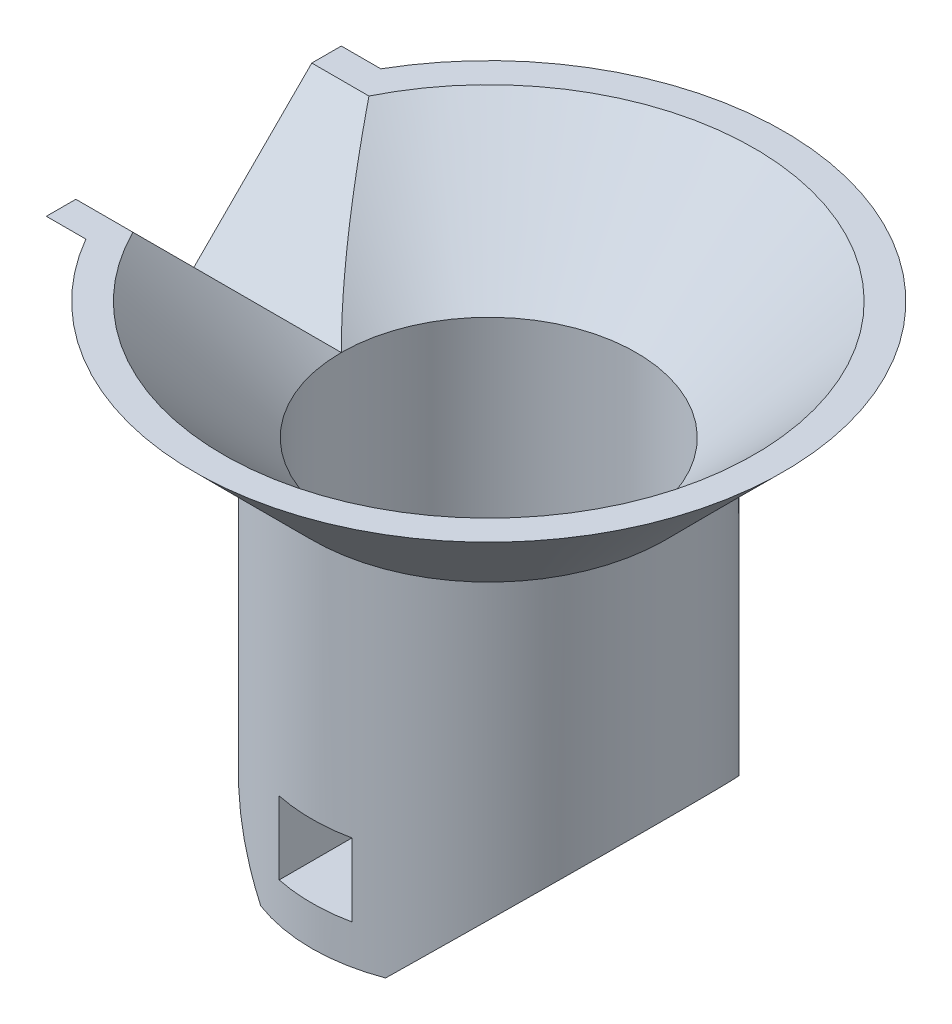
ISO-10303-21;
HEADER;
FILE_DESCRIPTION(('STEP AP214'),'2;1');
FILE_NAME('part.step','',(''),(''),'','','');
FILE_SCHEMA(('AUTOMOTIVE_DESIGN { 1 0 10303 214 1 1 1 1 }'));
ENDSEC;
DATA;
#1=APPLICATION_CONTEXT('core data for automotive mechanical design processes');
#2=APPLICATION_PROTOCOL_DEFINITION('international standard','automotive_design',2000,#1);
#3=PRODUCT_CONTEXT('',#1,'mechanical');
#4=PRODUCT('Part','Part','',(#3));
#5=PRODUCT_RELATED_PRODUCT_CATEGORY('part','',(#4));
#6=PRODUCT_DEFINITION_FORMATION('','',#4);
#7=PRODUCT_DEFINITION_CONTEXT('part definition',#1,'design');
#8=PRODUCT_DEFINITION('design','',#6,#7);
#9=PRODUCT_DEFINITION_SHAPE('','',#8);
#10=(LENGTH_UNIT() NAMED_UNIT(*) SI_UNIT(.MILLI.,.METRE.));
#11=(NAMED_UNIT(*) PLANE_ANGLE_UNIT() SI_UNIT($,.RADIAN.));
#12=(NAMED_UNIT(*) SI_UNIT($,.STERADIAN.) SOLID_ANGLE_UNIT());
#13=UNCERTAINTY_MEASURE_WITH_UNIT(LENGTH_MEASURE(1.E-05),#10,'distance_accuracy_value','');
#14=(GEOMETRIC_REPRESENTATION_CONTEXT(3) GLOBAL_UNCERTAINTY_ASSIGNED_CONTEXT((#13)) GLOBAL_UNIT_ASSIGNED_CONTEXT((#10,
#11,#12)) REPRESENTATION_CONTEXT('',''));
#15=CARTESIAN_POINT('',(0.,0.,0.));
#16=DIRECTION('',(0.,0.,1.));
#17=DIRECTION('',(1.,0.,0.));
#18=AXIS2_PLACEMENT_3D('',#15,#16,#17);
#19=CARTESIAN_POINT('',(500000.,16.5,0.));
#20=DIRECTION('',(0.,0.707106781186547,0.707106781186548));
#21=DIRECTION('',(0.,-0.707106781186548,0.707106781186547));
#22=AXIS2_PLACEMENT_3D('',#19,#20,#21);
#23=PLANE('',#22);
#24=DIRECTION('',(1.,0.,0.));
#25=VECTOR('',#24,1.);
#26=CARTESIAN_POINT('',(500000.,17.25,-0.75));
#27=LINE('',#26,#25);
#28=CARTESIAN_POINT('',(-15.,17.25,-0.75));
#29=VERTEX_POINT('',#28);
#30=CARTESIAN_POINT('',(-8.96869555731428,17.25,-0.75));
#31=VERTEX_POINT('',#30);
#32=EDGE_CURVE('E42',#29,#31,#27,.T.);
#33=ORIENTED_EDGE('',*,*,#32,.F.);
#34=DIRECTION('',(0.,0.707106781186548,-0.707106781186547));
#35=VECTOR('',#34,1.);
#36=CARTESIAN_POINT('',(-15.,16.5,0.));
#37=LINE('',#36,#35);
#38=CARTESIAN_POINT('',(-15.,24.,-7.5));
#39=VERTEX_POINT('',#38);
#40=EDGE_CURVE('E328',#29,#39,#37,.T.);
#41=ORIENTED_EDGE('',*,*,#40,.T.);
#42=DIRECTION('',(-1.,0.,0.));
#43=VECTOR('',#42,1.);
#44=CARTESIAN_POINT('',(500000.,24.,-7.5));
#45=LINE('',#44,#43);
#46=CARTESIAN_POINT('',(-12.9903810567384,24.,-7.5));
#47=VERTEX_POINT('',#46);
#48=EDGE_CURVE('E336',#47,#39,#45,.T.);
#49=ORIENTED_EDGE('',*,*,#48,.F.);
#50=CARTESIAN_POINT('',(-12.9904965263072,24.0002,-7.5002));
#51=CARTESIAN_POINT('',(-12.8417885807923,23.7426407491489,-7.24264074914892));
#52=CARTESIAN_POINT('',(-12.6909089126215,23.4857128176287,-6.98571281762869));
#53=CARTESIAN_POINT('',(-12.384370655667,22.9732753628268,-6.4732753628268));
#54=CARTESIAN_POINT('',(-12.2287118807498,22.7177658952494,-6.21776589524938));
#55=CARTESIAN_POINT('',(-11.7543725596912,21.95433918256,-5.45433918256002));
#56=CARTESIAN_POINT('',(-11.4279167122423,21.44880448999,-4.94880448999005));
#57=CARTESIAN_POINT('',(-10.9191975176582,20.6966810650989,-4.19668106509887));
#58=CARTESIAN_POINT('',(-10.7463689324467,20.4468908141695,-3.94689081416945));
#59=CARTESIAN_POINT('',(-10.3936692515622,19.949816332837,-3.44981633283699));
#60=CARTESIAN_POINT('',(-10.2137984821008,19.7025319870206,-3.20253198702059));
#61=CARTESIAN_POINT('',(-9.84593619543638,19.2105665143829,-2.71056651438294));
#62=CARTESIAN_POINT('',(-9.65793409250952,18.9658893314032,-2.46588933140316));
#63=CARTESIAN_POINT('',(-9.27294232527565,18.480046733962,-1.98004673396203));
#64=CARTESIAN_POINT('',(-9.07595114731007,18.2388819200302,-1.73888192003024));
#65=CARTESIAN_POINT('',(-8.87395064218863,17.9998,-1.4998));
#66=B_SPLINE_CURVE_WITH_KNOTS('',3,(#50,#51,#52,#53,#54,#55,#56,#57,#58,#59,#60,#61,#62,#63,#64,
#65),.UNSPECIFIED.,.F.,.F.,(4,2,2,2,2,2,2,4),(0.,1.18026959629429,2.36058521944181,
4.71792521500284,5.89766893658841,7.07735807401865,8.2586321492312,9.44010587700062),.UNSPECIFIED.);
#67=CARTESIAN_POINT('',(-8.87411967464942,18.,-1.5));
#68=VERTEX_POINT('',#67);
#69=EDGE_CURVE('E184',#47,#68,#66,.T.);
#70=ORIENTED_EDGE('',*,*,#69,.T.);
#71=CARTESIAN_POINT('',(0.,16.5,0.));
#72=DIRECTION('',(0.,0.707106781186547,0.707106781186548));
#73=DIRECTION('',(0.,-0.707106781186548,0.707106781186547));
#74=AXIS2_PLACEMENT_3D('',#71,#72,#73);
#75=ELLIPSE('',#74,12.7279220613579,9.);
#76=EDGE_CURVE('E176',#31,#68,#75,.F.);
#77=ORIENTED_EDGE('',*,*,#76,.F.);
#78=EDGE_LOOP('',(#33,#41,#49,#70,#77));
#79=FACE_BOUND('',#78,.T.);
#80=ADVANCED_FACE('F34',(#79),#23,.F.);
#81=CARTESIAN_POINT('',(0.,18.,0.));
#82=DIRECTION('',(0.,1.,0.));
#83=DIRECTION('',(0.,0.,1.));
#84=AXIS2_PLACEMENT_3D('',#81,#82,#83);
#85=CONICAL_SURFACE('',#84,9.,0.785398163397446);
#86=CARTESIAN_POINT('',(0.,24.,0.));
#87=DIRECTION('',(0.,-1.,0.));
#88=DIRECTION('',(0.,0.,-1.));
#89=AXIS2_PLACEMENT_3D('',#86,#87,#88);
#90=CIRCLE('',#89,15.);
#91=CARTESIAN_POINT('',(-12.9903810567384,24.,7.50000000000001));
#92=VERTEX_POINT('',#91);
#93=EDGE_CURVE('E363',#47,#92,#90,.T.);
#94=ORIENTED_EDGE('',*,*,#93,.T.);
#95=CARTESIAN_POINT('',(-8.87395064218863,17.9998,1.4998));
#96=CARTESIAN_POINT('',(-9.07595114731007,18.2388819200302,1.73888192003024));
#97=CARTESIAN_POINT('',(-9.27294232527565,18.480046733962,1.98004673396203));
#98=CARTESIAN_POINT('',(-9.65793409250952,18.9658893314032,2.46588933140316));
#99=CARTESIAN_POINT('',(-9.84593619543638,19.2105665143829,2.71056651438294));
#100=CARTESIAN_POINT('',(-10.2137984821008,19.7025319870206,3.20253198702059));
#101=CARTESIAN_POINT('',(-10.3936692515622,19.949816332837,3.44981633283699));
#102=CARTESIAN_POINT('',(-10.7463689324467,20.4468908141694,3.94689081416945));
#103=CARTESIAN_POINT('',(-10.9191975176581,20.6966810650989,4.19668106509887));
#104=CARTESIAN_POINT('',(-11.4279167122423,21.44880448999,4.94880448999005));
#105=CARTESIAN_POINT('',(-11.7543725596912,21.95433918256,5.45433918256002));
#106=CARTESIAN_POINT('',(-12.2287118807497,22.7177658952494,6.21776589524938));
#107=CARTESIAN_POINT('',(-12.384370655667,22.9732753628268,6.4732753628268));
#108=CARTESIAN_POINT('',(-12.6909089126215,23.4857128176287,6.98571281762868));
#109=CARTESIAN_POINT('',(-12.8417885807924,23.7426407491489,7.2426407491489));
#110=CARTESIAN_POINT('',(-12.9904965263073,24.0001999999999,7.50019999999994));
#111=B_SPLINE_CURVE_WITH_KNOTS('',3,(#95,#96,#97,#98,#99,#100,#101,#102,#103,#104,#105,#106,
#107,#108,#109,#110),.UNSPECIFIED.,.F.,.F.,(4,2,2,2,2,2,2,4),(0.,1.18147372776941,
2.36274780298197,3.5424369404122,4.72218066199777,7.07952065755879,8.25983628070631,
9.44010587700059),.UNSPECIFIED.);
#112=CARTESIAN_POINT('',(-8.87411967464942,18.,1.5));
#113=VERTEX_POINT('',#112);
#114=EDGE_CURVE('E177',#113,#92,#111,.T.);
#115=ORIENTED_EDGE('',*,*,#114,.F.);
#116=CARTESIAN_POINT('',(0.,18.,0.));
#117=DIRECTION('',(0.,1.,0.));
#118=DIRECTION('',(0.,0.,1.));
#119=AXIS2_PLACEMENT_3D('',#116,#117,#118);
#120=CIRCLE('',#119,9.);
#121=EDGE_CURVE('E301',#113,#68,#120,.T.);
#122=ORIENTED_EDGE('',*,*,#121,.T.);
#123=ORIENTED_EDGE('',*,*,#69,.F.);
#124=EDGE_LOOP('',(#94,#115,#122,#123));
#125=FACE_BOUND('',#124,.T.);
#126=ADVANCED_FACE('F209',(#125),#85,.T.);
#127=CARTESIAN_POINT('',(0.,18.,0.));
#128=DIRECTION('',(0.,-1.,0.));
#129=DIRECTION('',(0.,0.,-1.));
#130=AXIS2_PLACEMENT_3D('',#127,#128,#129);
#131=CYLINDRICAL_SURFACE('',#130,9.);
#132=CARTESIAN_POINT('',(0.,0.,0.));
#133=DIRECTION('',(0.,1.,0.));
#134=DIRECTION('',(0.,0.,1.));
#135=AXIS2_PLACEMENT_3D('',#132,#133,#134);
#136=CIRCLE('',#135,9.);
#137=CARTESIAN_POINT('',(-3.175,0.,8.42136420065063));
#138=VERTEX_POINT('',#137);
#139=CARTESIAN_POINT('',(3.175,0.,8.42136420065063));
#140=VERTEX_POINT('',#139);
#141=EDGE_CURVE('E298',#138,#140,#136,.T.);
#142=ORIENTED_EDGE('',*,*,#141,.T.);
#143=CARTESIAN_POINT('',(0.,-3.1068669527897,0.));
#144=DIRECTION('',(-0.699396374552726,0.714734014345549,0.));
#145=DIRECTION('',(-0.714734014345549,-0.699396374552726,0.));
#146=AXIS2_PLACEMENT_3D('',#143,#144,#145);
#147=ELLIPSE('',#146,12.5920969470593,9.);
#148=CARTESIAN_POINT('',(3.175,0.,-8.42136420065063));
#149=VERTEX_POINT('',#148);
#150=EDGE_CURVE('E302',#140,#149,#147,.T.);
#151=ORIENTED_EDGE('',*,*,#150,.T.);
#152=CARTESIAN_POINT('',(-3.175,0.,-8.42136420065063));
#153=VERTEX_POINT('',#152);
#154=EDGE_CURVE('E289',#149,#153,#136,.T.);
#155=ORIENTED_EDGE('',*,*,#154,.T.);
#156=CARTESIAN_POINT('',(0.,-3.1068669527897,0.));
#157=DIRECTION('',(0.699396374552726,0.714734014345549,0.));
#158=DIRECTION('',(0.714734014345549,-0.699396374552726,0.));
#159=AXIS2_PLACEMENT_3D('',#156,#157,#158);
#160=ELLIPSE('',#159,12.5920969470593,9.);
#161=EDGE_CURVE('E299',#153,#138,#160,.T.);
#162=ORIENTED_EDGE('',*,*,#161,.T.);
#163=EDGE_LOOP('',(#142,#151,#155,#162));
#164=FACE_BOUND('',#163,.T.);
#165=DIRECTION('',(0.,-1.,0.));
#166=VECTOR('',#165,1.);
#167=CARTESIAN_POINT('',(1.85,18.,8.80780903516874));
#168=LINE('',#167,#166);
#169=CARTESIAN_POINT('',(1.85,5.7,8.80780903516874));
#170=VERTEX_POINT('',#169);
#171=CARTESIAN_POINT('',(1.85,2.,8.80780903516873));
#172=VERTEX_POINT('',#171);
#173=EDGE_CURVE('E319',#170,#172,#168,.T.);
#174=ORIENTED_EDGE('',*,*,#173,.T.);
#175=CARTESIAN_POINT('',(0.,2.,0.));
#176=DIRECTION('',(0.,-1.,0.));
#177=DIRECTION('',(1.,0.,0.));
#178=AXIS2_PLACEMENT_3D('',#175,#176,#177);
#179=CIRCLE('',#178,9.);
#180=CARTESIAN_POINT('',(-1.85,2.,8.80780903516873));
#181=VERTEX_POINT('',#180);
#182=EDGE_CURVE('E308',#172,#181,#179,.T.);
#183=ORIENTED_EDGE('',*,*,#182,.T.);
#184=DIRECTION('',(0.,-1.,0.));
#185=VECTOR('',#184,1.);
#186=CARTESIAN_POINT('',(-1.85,18.,8.80780903516873));
#187=LINE('',#186,#185);
#188=CARTESIAN_POINT('',(-1.85,5.7,8.80780903516873));
#189=VERTEX_POINT('',#188);
#190=EDGE_CURVE('E315',#181,#189,#187,.F.);
#191=ORIENTED_EDGE('',*,*,#190,.T.);
#192=CARTESIAN_POINT('',(0.,5.7,0.));
#193=DIRECTION('',(0.,1.,0.));
#194=DIRECTION('',(-1.,0.,0.));
#195=AXIS2_PLACEMENT_3D('',#192,#193,#194);
#196=CIRCLE('',#195,9.);
#197=EDGE_CURVE('E311',#189,#170,#196,.T.);
#198=ORIENTED_EDGE('',*,*,#197,.T.);
#199=EDGE_LOOP('',(#174,#183,#191,#198));
#200=FACE_BOUND('',#199,.T.);
#201=DIRECTION('',(0.,-1.,0.));
#202=VECTOR('',#201,1.);
#203=CARTESIAN_POINT('',(-1.85,18.,-8.80780903516873));
#204=LINE('',#203,#202);
#205=CARTESIAN_POINT('',(-1.85,5.7,-8.80780903516873));
#206=VERTEX_POINT('',#205);
#207=CARTESIAN_POINT('',(-1.85,2.,-8.80780903516873));
#208=VERTEX_POINT('',#207);
#209=EDGE_CURVE('E325',#206,#208,#204,.T.);
#210=ORIENTED_EDGE('',*,*,#209,.T.);
#211=CARTESIAN_POINT('',(1.85,2.,-8.80780903516873));
#212=VERTEX_POINT('',#211);
#213=EDGE_CURVE('E312',#208,#212,#179,.T.);
#214=ORIENTED_EDGE('',*,*,#213,.T.);
#215=DIRECTION('',(0.,-1.,0.));
#216=VECTOR('',#215,1.);
#217=CARTESIAN_POINT('',(1.85,18.,-8.80780903516874));
#218=LINE('',#217,#216);
#219=CARTESIAN_POINT('',(1.85,5.7,-8.80780903516874));
#220=VERTEX_POINT('',#219);
#221=EDGE_CURVE('E322',#212,#220,#218,.F.);
#222=ORIENTED_EDGE('',*,*,#221,.T.);
#223=EDGE_CURVE('E316',#220,#206,#196,.T.);
#224=ORIENTED_EDGE('',*,*,#223,.T.);
#225=EDGE_LOOP('',(#210,#214,#222,#224));
#226=FACE_BOUND('',#225,.T.);
#227=CARTESIAN_POINT('',(0.,16.5,0.));
#228=DIRECTION('',(0.,0.707106781186548,-0.707106781186547));
#229=DIRECTION('',(0.,-0.707106781186547,-0.707106781186548));
#230=AXIS2_PLACEMENT_3D('',#227,#228,#229);
#231=ELLIPSE('',#230,12.7279220613578,9.);
#232=CARTESIAN_POINT('',(-8.96869555720059,17.25,0.75));
#233=VERTEX_POINT('',#232);
#234=EDGE_CURVE('E185',#113,#233,#231,.F.);
#235=ORIENTED_EDGE('',*,*,#234,.T.);
#236=DIRECTION('',(0.,-1.,0.));
#237=VECTOR('',#236,1.);
#238=CARTESIAN_POINT('',(-8.96869555732605,18.,0.75));
#239=LINE('',#238,#237);
#240=CARTESIAN_POINT('',(-8.96869555732605,10.4686955573261,0.75));
#241=VERTEX_POINT('',#240);
#242=EDGE_CURVE('E49',#233,#241,#239,.T.);
#243=ORIENTED_EDGE('',*,*,#242,.T.);
#244=CARTESIAN_POINT('',(0.,1.50000000000007,0.));
#245=DIRECTION('',(0.707106781186546,0.707106781186549,0.));
#246=DIRECTION('',(0.707106781186549,-0.707106781186546,0.));
#247=AXIS2_PLACEMENT_3D('',#244,#245,#246);
#248=ELLIPSE('',#247,12.7279220613578,9.);
#249=CARTESIAN_POINT('',(-8.96869555732605,10.4686955573261,-0.75));
#250=VERTEX_POINT('',#249);
#251=EDGE_CURVE('E53',#250,#241,#248,.T.);
#252=ORIENTED_EDGE('',*,*,#251,.F.);
#253=DIRECTION('',(0.,-1.,0.));
#254=VECTOR('',#253,1.);
#255=CARTESIAN_POINT('',(-8.96869555732605,18.,-0.75));
#256=LINE('',#255,#254);
#257=EDGE_CURVE('E166',#31,#250,#256,.T.);
#258=ORIENTED_EDGE('',*,*,#257,.F.);
#259=ORIENTED_EDGE('',*,*,#76,.T.);
#260=ORIENTED_EDGE('',*,*,#121,.F.);
#261=EDGE_LOOP('',(#235,#243,#252,#258,#259,#260));
#262=FACE_BOUND('',#261,.T.);
#263=ADVANCED_FACE('F36',(#164,#200,#226,#262),#131,.T.);
#264=CARTESIAN_POINT('',(0.,6.7,0.));
#265=DIRECTION('',(0.,-1.,0.));
#266=DIRECTION('',(1.,0.,0.));
#267=AXIS2_PLACEMENT_3D('',#264,#265,#266);
#268=PLANE('',#267);
#269=CARTESIAN_POINT('',(0.,6.7,0.));
#270=DIRECTION('',(0.,-1.,0.));
#271=DIRECTION('',(1.,0.,0.));
#272=AXIS2_PLACEMENT_3D('',#269,#270,#271);
#273=CIRCLE('',#272,7.5);
#274=CARTESIAN_POINT('',(7.5,6.70000000000001,0.));
#275=VERTEX_POINT('',#274);
#276=EDGE_CURVE('E379',#275,#275,#273,.F.);
#277=ORIENTED_EDGE('',*,*,#276,.T.);
#278=EDGE_LOOP('',(#277));
#279=FACE_BOUND('',#278,.T.);
#280=ADVANCED_FACE('F254',(#279),#268,.F.);
#281=CARTESIAN_POINT('',(0.,-14.5132034355964,0.));
#282=DIRECTION('',(0.,1.,0.));
#283=DIRECTION('',(0.,0.,1.));
#284=AXIS2_PLACEMENT_3D('',#281,#282,#283);
#285=CYLINDRICAL_SURFACE('',#284,7.5);
#286=CARTESIAN_POINT('',(0.,18.,0.));
#287=DIRECTION('',(0.,-1.,0.));
#288=DIRECTION('',(0.,0.,-1.));
#289=AXIS2_PLACEMENT_3D('',#286,#287,#288);
#290=CIRCLE('',#289,7.5);
#291=CARTESIAN_POINT('',(-7.5,18.,0.));
#292=VERTEX_POINT('',#291);
#293=EDGE_CURVE('E374',#292,#292,#290,.T.);
#294=ORIENTED_EDGE('',*,*,#293,.F.);
#295=EDGE_LOOP('',(#294));
#296=FACE_BOUND('',#295,.T.);
#297=ORIENTED_EDGE('',*,*,#276,.F.);
#298=EDGE_LOOP('',(#297));
#299=FACE_BOUND('',#298,.T.);
#300=ADVANCED_FACE('F249',(#296,#299),#285,.F.);
#301=CARTESIAN_POINT('',(15.,24.,0.));
#302=DIRECTION('',(0.,1.,0.));
#303=DIRECTION('',(0.,0.,1.));
#304=AXIS2_PLACEMENT_3D('',#301,#302,#303);
#305=PLANE('',#304);
#306=DIRECTION('',(1.,0.,0.));
#307=VECTOR('',#306,1.);
#308=CARTESIAN_POINT('',(-15.,24.,-6.));
#309=LINE('',#308,#307);
#310=CARTESIAN_POINT('',(-15.,24.,-6.));
#311=VERTEX_POINT('',#310);
#312=CARTESIAN_POINT('',(-12.0933866224478,24.,-6.));
#313=VERTEX_POINT('',#312);
#314=EDGE_CURVE('E234',#311,#313,#309,.T.);
#315=ORIENTED_EDGE('',*,*,#314,.T.);
#316=CARTESIAN_POINT('',(0.,24.,0.));
#317=DIRECTION('',(0.,-1.,0.));
#318=DIRECTION('',(0.,0.,-1.));
#319=AXIS2_PLACEMENT_3D('',#316,#317,#318);
#320=CIRCLE('',#319,13.5);
#321=CARTESIAN_POINT('',(-12.0933866224478,24.,6.));
#322=VERTEX_POINT('',#321);
#323=EDGE_CURVE('E370',#313,#322,#320,.T.);
#324=ORIENTED_EDGE('',*,*,#323,.T.);
#325=DIRECTION('',(1.,0.,0.));
#326=VECTOR('',#325,1.);
#327=CARTESIAN_POINT('',(-15.,24.,6.));
#328=LINE('',#327,#326);
#329=CARTESIAN_POINT('',(-15.,24.,6.));
#330=VERTEX_POINT('',#329);
#331=EDGE_CURVE('E355',#330,#322,#328,.T.);
#332=ORIENTED_EDGE('',*,*,#331,.F.);
#333=DIRECTION('',(0.,0.,1.));
#334=VECTOR('',#333,1.);
#335=CARTESIAN_POINT('',(-15.,24.,6.));
#336=LINE('',#335,#334);
#337=CARTESIAN_POINT('',(-15.,24.,7.50000000000001));
#338=VERTEX_POINT('',#337);
#339=EDGE_CURVE('E338',#330,#338,#336,.T.);
#340=ORIENTED_EDGE('',*,*,#339,.T.);
#341=DIRECTION('',(-1.,0.,0.));
#342=VECTOR('',#341,1.);
#343=CARTESIAN_POINT('',(500000.,24.,7.50000000000001));
#344=LINE('',#343,#342);
#345=EDGE_CURVE('E340',#92,#338,#344,.T.);
#346=ORIENTED_EDGE('',*,*,#345,.F.);
#347=ORIENTED_EDGE('',*,*,#93,.F.);
#348=ORIENTED_EDGE('',*,*,#48,.T.);
#349=DIRECTION('',(0.,0.,1.));
#350=VECTOR('',#349,1.);
#351=CARTESIAN_POINT('',(-15.,24.,-7.5));
#352=LINE('',#351,#350);
#353=EDGE_CURVE('E334',#39,#311,#352,.T.);
#354=ORIENTED_EDGE('',*,*,#353,.T.);
#355=EDGE_LOOP('',(#315,#324,#332,#340,#346,#347,#348,#354));
#356=FACE_BOUND('',#355,.T.);
#357=ADVANCED_FACE('F245',(#356),#305,.T.);
#358=CARTESIAN_POINT('',(0.,24.,0.));
#359=DIRECTION('',(0.,1.,0.));
#360=DIRECTION('',(0.,0.,1.));
#361=AXIS2_PLACEMENT_3D('',#358,#359,#360);
#362=CONICAL_SURFACE('',#361,13.5,0.785398163397447);
#363=CARTESIAN_POINT('',(-7.49979999733326,17.9998,0.000199999999999054));
#364=CARTESIAN_POINT('',(-7.61633642071679,18.1163419284678,-0.116341928467833));
#365=CARTESIAN_POINT('',(-7.7310675580444,18.233776785528,-0.233776785528009));
#366=CARTESIAN_POINT('',(-7.95716395153964,18.4702434778251,-0.470243477825078));
#367=CARTESIAN_POINT('',(-8.06852946419866,18.5892751903636,-0.589275190363638));
#368=CARTESIAN_POINT('',(-8.3978839923065,18.9484146006108,-0.948414600610814));
#369=CARTESIAN_POINT('',(-8.61122272350306,19.1906589874434,-1.19065898744343));
#370=CARTESIAN_POINT('',(-9.02662531164046,19.6791304434818,-1.67913044348177));
#371=CARTESIAN_POINT('',(-9.2287145605877,19.9253467785709,-1.92534677857093));
#372=CARTESIAN_POINT('',(-9.62351389595261,20.4215371460276,-2.42153714602759));
#373=CARTESIAN_POINT('',(-9.81622298031453,20.6715115761444,-2.67151157614435));
#374=CARTESIAN_POINT('',(-10.1929936964811,21.1741134864812,-3.17411348648124));
#375=CARTESIAN_POINT('',(-10.3770702620428,21.4267353845458,-3.42673538454581));
#376=CARTESIAN_POINT('',(-10.7378539992194,21.9345988340368,-3.93459883403685));
#377=CARTESIAN_POINT('',(-10.91456100779,22.1898404432663,-4.18984044326634));
#378=CARTESIAN_POINT('',(-11.2617798343757,22.7031626507115,-4.70316265071152));
#379=CARTESIAN_POINT('',(-11.4322759249168,22.9612485557696,-4.9612485557696));
#380=CARTESIAN_POINT('',(-11.7672479250405,23.4793483380272,-5.4793483380272));
#381=CARTESIAN_POINT('',(-11.9317242136862,23.7393620925871,-5.73936209258706));
#382=CARTESIAN_POINT('',(-12.0935106565463,24.0002,-6.0002));
#383=B_SPLINE_CURVE_WITH_KNOTS('',3,(#363,#364,#365,#366,#367,#368,#369,#370,#371,#372,#373,
#374,#375,#376,#377,#378,#379,#380,#381,#382),.UNSPECIFIED.,.F.,.F.,(4,2,2,2,2,2,2,2,2,4),(0.,
0.605530042282734,1.21101382066901,2.42150267873629,3.62913814106638,4.83690232971931,
6.04249364829035,7.24811162524804,8.45659588541389,9.66500391671582),.UNSPECIFIED.);
#384=EDGE_CURVE('E232',#292,#313,#383,.T.);
#385=ORIENTED_EDGE('',*,*,#384,.F.);
#386=ORIENTED_EDGE('',*,*,#293,.T.);
#387=CARTESIAN_POINT('',(-12.0935106565463,24.0002,6.0002));
#388=CARTESIAN_POINT('',(-11.9317242136862,23.7393620925871,5.73936209258706));
#389=CARTESIAN_POINT('',(-11.7672479250405,23.4793483380272,5.4793483380272));
#390=CARTESIAN_POINT('',(-11.4322759249168,22.9612485557696,4.9612485557696));
#391=CARTESIAN_POINT('',(-11.2617798343757,22.7031626507115,4.70316265071152));
#392=CARTESIAN_POINT('',(-10.91456100779,22.1898404432663,4.18984044326634));
#393=CARTESIAN_POINT('',(-10.7378539992193,21.9345988340368,3.93459883403685));
#394=CARTESIAN_POINT('',(-10.3770702620428,21.4267353845458,3.42673538454581));
#395=CARTESIAN_POINT('',(-10.1929936964811,21.1741134864812,3.17411348648124));
#396=CARTESIAN_POINT('',(-9.81622298031453,20.6715115761444,2.67151157614435));
#397=CARTESIAN_POINT('',(-9.62351389595261,20.4215371460276,2.42153714602759));
#398=CARTESIAN_POINT('',(-9.22871456058771,19.9253467785709,1.92534677857093));
#399=CARTESIAN_POINT('',(-9.02662531164046,19.6791304434818,1.67913044348177));
#400=CARTESIAN_POINT('',(-8.61122272350306,19.1906589874434,1.19065898744343));
#401=CARTESIAN_POINT('',(-8.3978839923065,18.9484146006108,0.948414600610815));
#402=CARTESIAN_POINT('',(-8.06852946419866,18.5892751903636,0.589275190363638));
#403=CARTESIAN_POINT('',(-7.95716395153964,18.4702434778251,0.470243477825077));
#404=CARTESIAN_POINT('',(-7.7310675580444,18.233776785528,0.233776785528008));
#405=CARTESIAN_POINT('',(-7.61633642071679,18.1163419284678,0.116341928467832));
#406=CARTESIAN_POINT('',(-7.49979999733326,17.9998,-0.000199999999999329));
#407=B_SPLINE_CURVE_WITH_KNOTS('',3,(#387,#388,#389,#390,#391,#392,#393,#394,#395,#396,#397,
#398,#399,#400,#401,#402,#403,#404,#405,#406),.UNSPECIFIED.,.F.,.F.,(4,2,2,2,2,2,2,2,2,4),(0.,
1.20840803130193,2.41689229146778,3.62251026842548,4.82810158699651,6.03586577564944,
7.24350123797953,8.45399009604681,9.05947387443309,9.66500391671582),.UNSPECIFIED.);
#408=EDGE_CURVE('E226',#322,#292,#407,.T.);
#409=ORIENTED_EDGE('',*,*,#408,.F.);
#410=ORIENTED_EDGE('',*,*,#323,.F.);
#411=EDGE_LOOP('',(#385,#386,#409,#410));
#412=FACE_BOUND('',#411,.T.);
#413=ADVANCED_FACE('F240',(#412),#362,.F.);
#414=CARTESIAN_POINT('',(-9.,5.7,-9.));
#415=DIRECTION('',(0.699396374552726,0.714734014345549,0.));
#416=DIRECTION('',(-0.714734014345549,0.699396374552726,0.));
#417=AXIS2_PLACEMENT_3D('',#414,#415,#416);
#418=PLANE('',#417);
#419=DIRECTION('',(0.,0.,-1.));
#420=VECTOR('',#419,1.);
#421=CARTESIAN_POINT('',(-3.175,0.,0.));
#422=LINE('',#421,#420);
#423=EDGE_CURVE('E295',#138,#153,#422,.T.);
#424=ORIENTED_EDGE('',*,*,#423,.F.);
#425=ORIENTED_EDGE('',*,*,#161,.F.);
#426=EDGE_LOOP('',(#424,#425));
#427=FACE_BOUND('',#426,.T.);
#428=ADVANCED_FACE('F244',(#427),#418,.F.);
#429=CARTESIAN_POINT('',(3.175,0.,-9.));
#430=DIRECTION('',(-0.699396374552726,0.714734014345549,0.));
#431=DIRECTION('',(-0.714734014345549,-0.699396374552726,0.));
#432=AXIS2_PLACEMENT_3D('',#429,#430,#431);
#433=PLANE('',#432);
#434=DIRECTION('',(0.,0.,1.));
#435=VECTOR('',#434,1.);
#436=CARTESIAN_POINT('',(3.175,0.,0.));
#437=LINE('',#436,#435);
#438=EDGE_CURVE('E292',#149,#140,#437,.T.);
#439=ORIENTED_EDGE('',*,*,#438,.F.);
#440=ORIENTED_EDGE('',*,*,#150,.F.);
#441=EDGE_LOOP('',(#439,#440));
#442=FACE_BOUND('',#441,.T.);
#443=ADVANCED_FACE('F276',(#442),#433,.F.);
#444=CARTESIAN_POINT('',(0.,0.,0.));
#445=DIRECTION('',(0.,1.,0.));
#446=DIRECTION('',(0.,0.,1.));
#447=AXIS2_PLACEMENT_3D('',#444,#445,#446);
#448=PLANE('',#447);
#449=ORIENTED_EDGE('',*,*,#154,.F.);
#450=ORIENTED_EDGE('',*,*,#438,.T.);
#451=ORIENTED_EDGE('',*,*,#141,.F.);
#452=ORIENTED_EDGE('',*,*,#423,.T.);
#453=EDGE_LOOP('',(#449,#450,#451,#452));
#454=FACE_BOUND('',#453,.T.);
#455=ADVANCED_FACE('F263',(#454),#448,.F.);
#456=CARTESIAN_POINT('',(-1.85,5.7,-9.));
#457=DIRECTION('',(0.,1.,0.));
#458=DIRECTION('',(-1.,0.,0.));
#459=AXIS2_PLACEMENT_3D('',#456,#457,#458);
#460=PLANE('',#459);
#461=DIRECTION('',(0.,0.,1.));
#462=VECTOR('',#461,1.);
#463=CARTESIAN_POINT('',(-1.85,5.7,-9.));
#464=LINE('',#463,#462);
#465=EDGE_CURVE('E383',#206,#189,#464,.T.);
#466=ORIENTED_EDGE('',*,*,#465,.F.);
#467=ORIENTED_EDGE('',*,*,#223,.F.);
#468=DIRECTION('',(0.,0.,1.));
#469=VECTOR('',#468,1.);
#470=CARTESIAN_POINT('',(1.85,5.7,-9.));
#471=LINE('',#470,#469);
#472=EDGE_CURVE('E386',#220,#170,#471,.T.);
#473=ORIENTED_EDGE('',*,*,#472,.T.);
#474=ORIENTED_EDGE('',*,*,#197,.F.);
#475=EDGE_LOOP('',(#466,#467,#473,#474));
#476=FACE_BOUND('',#475,.T.);
#477=ADVANCED_FACE('F259',(#476),#460,.F.);
#478=CARTESIAN_POINT('',(1.85,5.7,-9.));
#479=DIRECTION('',(1.,0.,0.));
#480=DIRECTION('',(0.,1.,0.));
#481=AXIS2_PLACEMENT_3D('',#478,#479,#480);
#482=PLANE('',#481);
#483=ORIENTED_EDGE('',*,*,#472,.F.);
#484=ORIENTED_EDGE('',*,*,#221,.F.);
#485=DIRECTION('',(0.,0.,1.));
#486=VECTOR('',#485,1.);
#487=CARTESIAN_POINT('',(1.85,2.,-9.));
#488=LINE('',#487,#486);
#489=EDGE_CURVE('E389',#212,#172,#488,.T.);
#490=ORIENTED_EDGE('',*,*,#489,.T.);
#491=ORIENTED_EDGE('',*,*,#173,.F.);
#492=EDGE_LOOP('',(#483,#484,#490,#491));
#493=FACE_BOUND('',#492,.T.);
#494=ADVANCED_FACE('F262',(#493),#482,.F.);
#495=CARTESIAN_POINT('',(-1.85,2.,-9.));
#496=DIRECTION('',(0.,-1.,0.));
#497=DIRECTION('',(1.,0.,0.));
#498=AXIS2_PLACEMENT_3D('',#495,#496,#497);
#499=PLANE('',#498);
#500=ORIENTED_EDGE('',*,*,#489,.F.);
#501=ORIENTED_EDGE('',*,*,#213,.F.);
#502=DIRECTION('',(0.,0.,1.));
#503=VECTOR('',#502,1.);
#504=CARTESIAN_POINT('',(-1.85,2.,-9.));
#505=LINE('',#504,#503);
#506=EDGE_CURVE('E382',#208,#181,#505,.T.);
#507=ORIENTED_EDGE('',*,*,#506,.T.);
#508=ORIENTED_EDGE('',*,*,#182,.F.);
#509=EDGE_LOOP('',(#500,#501,#507,#508));
#510=FACE_BOUND('',#509,.T.);
#511=ADVANCED_FACE('F267',(#510),#499,.F.);
#512=CARTESIAN_POINT('',(-1.85,5.7,-9.));
#513=DIRECTION('',(-1.,0.,0.));
#514=DIRECTION('',(0.,-1.,0.));
#515=AXIS2_PLACEMENT_3D('',#512,#513,#514);
#516=PLANE('',#515);
#517=ORIENTED_EDGE('',*,*,#465,.T.);
#518=ORIENTED_EDGE('',*,*,#190,.F.);
#519=ORIENTED_EDGE('',*,*,#506,.F.);
#520=ORIENTED_EDGE('',*,*,#209,.F.);
#521=EDGE_LOOP('',(#517,#518,#519,#520));
#522=FACE_BOUND('',#521,.T.);
#523=ADVANCED_FACE('F271',(#522),#516,.F.);
#524=CARTESIAN_POINT('',(-15.,24.,-6.));
#525=DIRECTION('',(0.,-0.707106781186548,-0.707106781186547));
#526=DIRECTION('',(0.,0.707106781186547,-0.707106781186548));
#527=AXIS2_PLACEMENT_3D('',#524,#525,#526);
#528=PLANE('',#527);
#529=ORIENTED_EDGE('',*,*,#314,.F.);
#530=DIRECTION('',(0.,-0.707106781186547,0.707106781186548));
#531=VECTOR('',#530,1.);
#532=CARTESIAN_POINT('',(-15.,24.,-6.));
#533=LINE('',#532,#531);
#534=CARTESIAN_POINT('',(-15.,18.,0.));
#535=VERTEX_POINT('',#534);
#536=EDGE_CURVE('E348',#311,#535,#533,.T.);
#537=ORIENTED_EDGE('',*,*,#536,.T.);
#538=DIRECTION('',(1.,0.,0.));
#539=VECTOR('',#538,1.);
#540=CARTESIAN_POINT('',(-15.,18.,0.));
#541=LINE('',#540,#539);
#542=EDGE_CURVE('E233',#535,#292,#541,.T.);
#543=ORIENTED_EDGE('',*,*,#542,.T.);
#544=ORIENTED_EDGE('',*,*,#384,.T.);
#545=EDGE_LOOP('',(#529,#537,#543,#544));
#546=FACE_BOUND('',#545,.T.);
#547=ADVANCED_FACE('F221',(#546),#528,.F.);
#548=CARTESIAN_POINT('',(-15.,18.,0.));
#549=DIRECTION('',(0.,-0.707106781186548,0.707106781186547));
#550=DIRECTION('',(0.,-0.707106781186547,-0.707106781186548));
#551=AXIS2_PLACEMENT_3D('',#548,#549,#550);
#552=PLANE('',#551);
#553=ORIENTED_EDGE('',*,*,#542,.F.);
#554=DIRECTION('',(0.,0.707106781186547,0.707106781186548));
#555=VECTOR('',#554,1.);
#556=CARTESIAN_POINT('',(-15.,18.,0.));
#557=LINE('',#556,#555);
#558=EDGE_CURVE('E345',#535,#330,#557,.T.);
#559=ORIENTED_EDGE('',*,*,#558,.T.);
#560=ORIENTED_EDGE('',*,*,#331,.T.);
#561=ORIENTED_EDGE('',*,*,#408,.T.);
#562=EDGE_LOOP('',(#553,#559,#560,#561));
#563=FACE_BOUND('',#562,.T.);
#564=ADVANCED_FACE('F198',(#563),#552,.F.);
#565=CARTESIAN_POINT('',(-15.,0.,0.));
#566=DIRECTION('',(1.,0.,0.));
#567=DIRECTION('',(0.,0.,-1.));
#568=AXIS2_PLACEMENT_3D('',#565,#566,#567);
#569=PLANE('',#568);
#570=ORIENTED_EDGE('',*,*,#558,.F.);
#571=ORIENTED_EDGE('',*,*,#536,.F.);
#572=ORIENTED_EDGE('',*,*,#353,.F.);
#573=ORIENTED_EDGE('',*,*,#40,.F.);
#574=DIRECTION('',(0.,-1.,0.));
#575=VECTOR('',#574,1.);
#576=CARTESIAN_POINT('',(-15.,18.,-0.75));
#577=LINE('',#576,#575);
#578=CARTESIAN_POINT('',(-15.,16.5,-0.75));
#579=VERTEX_POINT('',#578);
#580=EDGE_CURVE('E162',#29,#579,#577,.T.);
#581=ORIENTED_EDGE('',*,*,#580,.T.);
#582=DIRECTION('',(0.,0.,-1.));
#583=VECTOR('',#582,1.);
#584=CARTESIAN_POINT('',(-15.,16.5,0.75));
#585=LINE('',#584,#583);
#586=CARTESIAN_POINT('',(-15.,16.5,0.75));
#587=VERTEX_POINT('',#586);
#588=EDGE_CURVE('E157',#587,#579,#585,.T.);
#589=ORIENTED_EDGE('',*,*,#588,.F.);
#590=DIRECTION('',(0.,-1.,0.));
#591=VECTOR('',#590,1.);
#592=CARTESIAN_POINT('',(-15.,18.,0.75));
#593=LINE('',#592,#591);
#594=CARTESIAN_POINT('',(-15.,17.25,0.750000000000001));
#595=VERTEX_POINT('',#594);
#596=EDGE_CURVE('E147',#595,#587,#593,.T.);
#597=ORIENTED_EDGE('',*,*,#596,.F.);
#598=DIRECTION('',(0.,-0.707106781186547,-0.707106781186548));
#599=VECTOR('',#598,1.);
#600=CARTESIAN_POINT('',(-15.,24.,7.50000000000001));
#601=LINE('',#600,#599);
#602=EDGE_CURVE('E335',#338,#595,#601,.T.);
#603=ORIENTED_EDGE('',*,*,#602,.F.);
#604=ORIENTED_EDGE('',*,*,#339,.F.);
#605=EDGE_LOOP('',(#570,#571,#572,#573,#581,#589,#597,#603,#604));
#606=FACE_BOUND('',#605,.T.);
#607=ADVANCED_FACE('F159',(#606),#569,.F.);
#608=CARTESIAN_POINT('',(500000.,24.,7.50000000000001));
#609=DIRECTION('',(0.,0.707106781186548,-0.707106781186547));
#610=DIRECTION('',(0.,0.707106781186547,0.707106781186548));
#611=AXIS2_PLACEMENT_3D('',#608,#609,#610);
#612=PLANE('',#611);
#613=ORIENTED_EDGE('',*,*,#602,.T.);
#614=DIRECTION('',(1.,0.,0.));
#615=VECTOR('',#614,1.);
#616=CARTESIAN_POINT('',(500000.,17.25,0.75));
#617=LINE('',#616,#615);
#618=EDGE_CURVE('E11',#595,#233,#617,.T.);
#619=ORIENTED_EDGE('',*,*,#618,.T.);
#620=ORIENTED_EDGE('',*,*,#234,.F.);
#621=ORIENTED_EDGE('',*,*,#114,.T.);
#622=ORIENTED_EDGE('',*,*,#345,.T.);
#623=EDGE_LOOP('',(#613,#619,#620,#621,#622));
#624=FACE_BOUND('',#623,.T.);
#625=ADVANCED_FACE('F191',(#624),#612,.F.);
#626=CARTESIAN_POINT('',(-15.,16.5,0.75));
#627=DIRECTION('',(0.707106781186546,0.707106781186549,0.));
#628=DIRECTION('',(-0.707106781186549,0.707106781186546,0.));
#629=AXIS2_PLACEMENT_3D('',#626,#627,#628);
#630=PLANE('',#629);
#631=DIRECTION('',(0.707106781186549,-0.707106781186546,0.));
#632=VECTOR('',#631,1.);
#633=CARTESIAN_POINT('',(-15.,16.5,-0.75));
#634=LINE('',#633,#632);
#635=EDGE_CURVE('E154',#579,#250,#634,.T.);
#636=ORIENTED_EDGE('',*,*,#635,.T.);
#637=ORIENTED_EDGE('',*,*,#251,.T.);
#638=DIRECTION('',(0.707106781186549,-0.707106781186546,0.));
#639=VECTOR('',#638,1.);
#640=CARTESIAN_POINT('',(-15.,16.5,0.75));
#641=LINE('',#640,#639);
#642=EDGE_CURVE('E151',#587,#241,#641,.T.);
#643=ORIENTED_EDGE('',*,*,#642,.F.);
#644=ORIENTED_EDGE('',*,*,#588,.T.);
#645=EDGE_LOOP('',(#636,#637,#643,#644));
#646=FACE_BOUND('',#645,.T.);
#647=ADVANCED_FACE('F168',(#646),#630,.F.);
#648=CARTESIAN_POINT('',(0.,0.,0.75));
#649=DIRECTION('',(0.,0.,1.));
#650=DIRECTION('',(1.,0.,0.));
#651=AXIS2_PLACEMENT_3D('',#648,#649,#650);
#652=PLANE('',#651);
#653=ORIENTED_EDGE('',*,*,#242,.F.);
#654=ORIENTED_EDGE('',*,*,#618,.F.);
#655=ORIENTED_EDGE('',*,*,#596,.T.);
#656=ORIENTED_EDGE('',*,*,#642,.T.);
#657=EDGE_LOOP('',(#653,#654,#655,#656));
#658=FACE_BOUND('',#657,.T.);
#659=ADVANCED_FACE('F149',(#658),#652,.T.);
#660=CARTESIAN_POINT('',(0.,0.,-0.75));
#661=DIRECTION('',(0.,0.,1.));
#662=DIRECTION('',(1.,0.,0.));
#663=AXIS2_PLACEMENT_3D('',#660,#661,#662);
#664=PLANE('',#663);
#665=ORIENTED_EDGE('',*,*,#32,.T.);
#666=ORIENTED_EDGE('',*,*,#257,.T.);
#667=ORIENTED_EDGE('',*,*,#635,.F.);
#668=ORIENTED_EDGE('',*,*,#580,.F.);
#669=EDGE_LOOP('',(#665,#666,#667,#668));
#670=FACE_BOUND('',#669,.T.);
#671=ADVANCED_FACE('F201',(#670),#664,.F.);
#672=CLOSED_SHELL('',(#80,#126,#263,#280,#300,#357,#413,#428,#443,#455,#477,#494,#511,#523,#547,
#564,#607,#625,#647,#659,#671));
#673=MANIFOLD_SOLID_BREP('B2',#672);
#674=ADVANCED_BREP_SHAPE_REPRESENTATION('',(#18,#673),#14);
#675=SHAPE_DEFINITION_REPRESENTATION(#9,#674);
ENDSEC;
END-ISO-10303-21;
